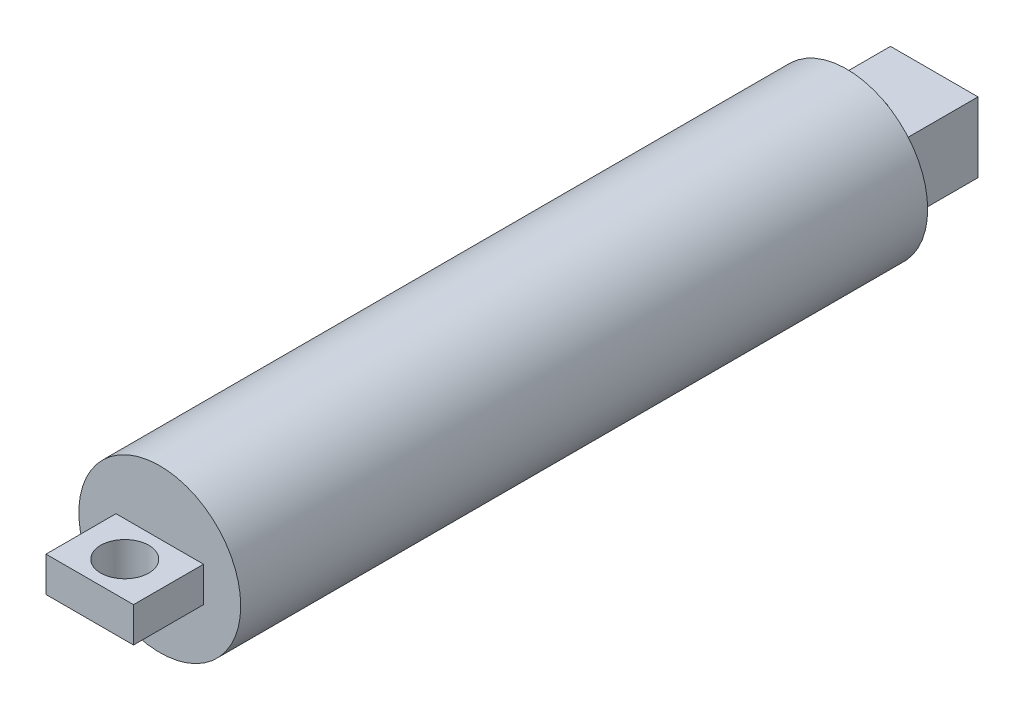
ISO-10303-21;
HEADER;
FILE_DESCRIPTION(('STEP AP214'),'2;1');
FILE_NAME('part.step','',(''),(''),'','','');
FILE_SCHEMA(('AUTOMOTIVE_DESIGN { 1 0 10303 214 1 1 1 1 }'));
ENDSEC;
DATA;
#1=APPLICATION_CONTEXT('core data for automotive mechanical design processes');
#2=APPLICATION_PROTOCOL_DEFINITION('international standard','automotive_design',2000,#1);
#3=PRODUCT_CONTEXT('',#1,'mechanical');
#4=PRODUCT('Part','Part','',(#3));
#5=PRODUCT_RELATED_PRODUCT_CATEGORY('part','',(#4));
#6=PRODUCT_DEFINITION_FORMATION('','',#4);
#7=PRODUCT_DEFINITION_CONTEXT('part definition',#1,'design');
#8=PRODUCT_DEFINITION('design','',#6,#7);
#9=PRODUCT_DEFINITION_SHAPE('','',#8);
#10=(LENGTH_UNIT() NAMED_UNIT(*) SI_UNIT(.MILLI.,.METRE.));
#11=(NAMED_UNIT(*) PLANE_ANGLE_UNIT() SI_UNIT($,.RADIAN.));
#12=(NAMED_UNIT(*) SI_UNIT($,.STERADIAN.) SOLID_ANGLE_UNIT());
#13=UNCERTAINTY_MEASURE_WITH_UNIT(LENGTH_MEASURE(1.E-05),#10,'distance_accuracy_value','');
#14=(GEOMETRIC_REPRESENTATION_CONTEXT(3) GLOBAL_UNCERTAINTY_ASSIGNED_CONTEXT((#13)) GLOBAL_UNIT_ASSIGNED_CONTEXT((#10,
#11,#12)) REPRESENTATION_CONTEXT('',''));
#15=CARTESIAN_POINT('',(0.,0.,0.));
#16=DIRECTION('',(0.,0.,1.));
#17=DIRECTION('',(1.,0.,0.));
#18=AXIS2_PLACEMENT_3D('',#15,#16,#17);
#19=CARTESIAN_POINT('',(0.,0.,0.));
#20=DIRECTION('',(0.,0.,1.));
#21=DIRECTION('',(1.,0.,0.));
#22=AXIS2_PLACEMENT_3D('',#19,#20,#21);
#23=PLANE('',#22);
#24=CARTESIAN_POINT('',(0.,0.,0.));
#25=DIRECTION('',(0.,0.,1.));
#26=DIRECTION('',(1.,0.,0.));
#27=AXIS2_PLACEMENT_3D('',#24,#25,#26);
#28=CIRCLE('',#27,9.25);
#29=CARTESIAN_POINT('',(9.25,0.,0.));
#30=VERTEX_POINT('',#29);
#31=EDGE_CURVE('E50',#30,#30,#28,.T.);
#32=ORIENTED_EDGE('',*,*,#31,.F.);
#33=EDGE_LOOP('',(#32));
#34=FACE_BOUND('',#33,.T.);
#35=DIRECTION('',(0.,-1.,0.));
#36=VECTOR('',#35,1.);
#37=CARTESIAN_POINT('',(5.,-4.,0.));
#38=LINE('',#37,#36);
#39=CARTESIAN_POINT('',(5.,4.,0.));
#40=VERTEX_POINT('',#39);
#41=CARTESIAN_POINT('',(5.,-4.,0.));
#42=VERTEX_POINT('',#41);
#43=EDGE_CURVE('E128',#40,#42,#38,.T.);
#44=ORIENTED_EDGE('',*,*,#43,.F.);
#45=DIRECTION('',(1.,0.,0.));
#46=VECTOR('',#45,1.);
#47=CARTESIAN_POINT('',(-5.,4.,0.));
#48=LINE('',#47,#46);
#49=CARTESIAN_POINT('',(-5.,4.,0.));
#50=VERTEX_POINT('',#49);
#51=EDGE_CURVE('E141',#50,#40,#48,.T.);
#52=ORIENTED_EDGE('',*,*,#51,.F.);
#53=DIRECTION('',(0.,1.,0.));
#54=VECTOR('',#53,1.);
#55=CARTESIAN_POINT('',(-5.,-4.,0.));
#56=LINE('',#55,#54);
#57=CARTESIAN_POINT('',(-5.,-4.,0.));
#58=VERTEX_POINT('',#57);
#59=EDGE_CURVE('E150',#58,#50,#56,.T.);
#60=ORIENTED_EDGE('',*,*,#59,.F.);
#61=DIRECTION('',(-1.,0.,0.));
#62=VECTOR('',#61,1.);
#63=CARTESIAN_POINT('',(-5.,-4.,0.));
#64=LINE('',#63,#62);
#65=EDGE_CURVE('E131',#42,#58,#64,.T.);
#66=ORIENTED_EDGE('',*,*,#65,.F.);
#67=EDGE_LOOP('',(#44,#52,#60,#66));
#68=FACE_BOUND('',#67,.T.);
#69=ADVANCED_FACE('F41',(#34,#68),#23,.F.);
#70=CARTESIAN_POINT('',(0.,0.,78.5));
#71=DIRECTION('',(0.,0.,-1.));
#72=DIRECTION('',(-1.,0.,0.));
#73=AXIS2_PLACEMENT_3D('',#70,#71,#72);
#74=CYLINDRICAL_SURFACE('',#73,9.25);
#75=CARTESIAN_POINT('',(0.,0.,78.5));
#76=DIRECTION('',(0.,0.,1.));
#77=DIRECTION('',(1.,0.,0.));
#78=AXIS2_PLACEMENT_3D('',#75,#76,#77);
#79=CIRCLE('',#78,9.25);
#80=CARTESIAN_POINT('',(9.25,0.,78.5));
#81=VERTEX_POINT('',#80);
#82=EDGE_CURVE('E11',#81,#81,#79,.T.);
#83=ORIENTED_EDGE('',*,*,#82,.F.);
#84=EDGE_LOOP('',(#83));
#85=FACE_BOUND('',#84,.T.);
#86=ORIENTED_EDGE('',*,*,#31,.T.);
#87=EDGE_LOOP('',(#86));
#88=FACE_BOUND('',#87,.T.);
#89=ADVANCED_FACE('F43',(#85,#88),#74,.T.);
#90=CARTESIAN_POINT('',(0.,0.,78.5));
#91=DIRECTION('',(0.,0.,1.));
#92=DIRECTION('',(1.,0.,0.));
#93=AXIS2_PLACEMENT_3D('',#90,#91,#92);
#94=PLANE('',#93);
#95=DIRECTION('',(0.,-1.,0.));
#96=VECTOR('',#95,1.);
#97=CARTESIAN_POINT('',(-5.,-2.,78.5));
#98=LINE('',#97,#96);
#99=CARTESIAN_POINT('',(-5.,2.,78.5));
#100=VERTEX_POINT('',#99);
#101=CARTESIAN_POINT('',(-5.,-2.,78.5));
#102=VERTEX_POINT('',#101);
#103=EDGE_CURVE('E58',#100,#102,#98,.T.);
#104=ORIENTED_EDGE('',*,*,#103,.F.);
#105=DIRECTION('',(-1.,0.,0.));
#106=VECTOR('',#105,1.);
#107=CARTESIAN_POINT('',(5.,2.,78.5));
#108=LINE('',#107,#106);
#109=CARTESIAN_POINT('',(5.,2.,78.5));
#110=VERTEX_POINT('',#109);
#111=EDGE_CURVE('E62',#110,#100,#108,.T.);
#112=ORIENTED_EDGE('',*,*,#111,.F.);
#113=DIRECTION('',(0.,1.,0.));
#114=VECTOR('',#113,1.);
#115=CARTESIAN_POINT('',(5.,-2.,78.5));
#116=LINE('',#115,#114);
#117=CARTESIAN_POINT('',(5.,-2.,78.5));
#118=VERTEX_POINT('',#117);
#119=EDGE_CURVE('E187',#118,#110,#116,.T.);
#120=ORIENTED_EDGE('',*,*,#119,.F.);
#121=DIRECTION('',(1.,0.,0.));
#122=VECTOR('',#121,1.);
#123=CARTESIAN_POINT('',(5.,-2.,78.5));
#124=LINE('',#123,#122);
#125=EDGE_CURVE('E185',#102,#118,#124,.T.);
#126=ORIENTED_EDGE('',*,*,#125,.F.);
#127=EDGE_LOOP('',(#104,#112,#120,#126));
#128=FACE_BOUND('',#127,.T.);
#129=ORIENTED_EDGE('',*,*,#82,.T.);
#130=EDGE_LOOP('',(#129));
#131=FACE_BOUND('',#130,.T.);
#132=ADVANCED_FACE('F196',(#128,#131),#94,.T.);
#133=CARTESIAN_POINT('',(5.,-4.,-10.));
#134=DIRECTION('',(-1.,0.,0.));
#135=DIRECTION('',(0.,0.,1.));
#136=AXIS2_PLACEMENT_3D('',#133,#134,#135);
#137=PLANE('',#136);
#138=ORIENTED_EDGE('',*,*,#43,.T.);
#139=DIRECTION('',(0.,0.,1.));
#140=VECTOR('',#139,1.);
#141=CARTESIAN_POINT('',(5.,-4.,-10.));
#142=LINE('',#141,#140);
#143=CARTESIAN_POINT('',(5.,-4.,-10.));
#144=VERTEX_POINT('',#143);
#145=EDGE_CURVE('E163',#144,#42,#142,.T.);
#146=ORIENTED_EDGE('',*,*,#145,.F.);
#147=DIRECTION('',(0.,-1.,0.));
#148=VECTOR('',#147,1.);
#149=CARTESIAN_POINT('',(5.,-4.,-10.));
#150=LINE('',#149,#148);
#151=CARTESIAN_POINT('',(5.,4.,-10.));
#152=VERTEX_POINT('',#151);
#153=EDGE_CURVE('E137',#152,#144,#150,.T.);
#154=ORIENTED_EDGE('',*,*,#153,.F.);
#155=DIRECTION('',(0.,0.,1.));
#156=VECTOR('',#155,1.);
#157=CARTESIAN_POINT('',(5.,4.,-10.));
#158=LINE('',#157,#156);
#159=EDGE_CURVE('E146',#152,#40,#158,.T.);
#160=ORIENTED_EDGE('',*,*,#159,.T.);
#161=EDGE_LOOP('',(#138,#146,#154,#160));
#162=FACE_BOUND('',#161,.T.);
#163=ADVANCED_FACE('F199',(#162),#137,.F.);
#164=CARTESIAN_POINT('',(-5.,-4.,-10.));
#165=DIRECTION('',(0.,1.,0.));
#166=DIRECTION('',(-1.,0.,0.));
#167=AXIS2_PLACEMENT_3D('',#164,#165,#166);
#168=PLANE('',#167);
#169=CARTESIAN_POINT('',(0.,-4.,-2.50000000000002));
#170=DIRECTION('',(0.,1.,0.));
#171=DIRECTION('',(-1.,0.,0.));
#172=AXIS2_PLACEMENT_3D('',#169,#170,#171);
#173=CIRCLE('',#172,1.65);
#174=CARTESIAN_POINT('',(-1.65,-4.,-2.50000000000002));
#175=VERTEX_POINT('',#174);
#176=EDGE_CURVE('E177',#175,#175,#173,.T.);
#177=ORIENTED_EDGE('',*,*,#176,.T.);
#178=EDGE_LOOP('',(#177));
#179=FACE_BOUND('',#178,.T.);
#180=ORIENTED_EDGE('',*,*,#65,.T.);
#181=DIRECTION('',(0.,0.,1.));
#182=VECTOR('',#181,1.);
#183=CARTESIAN_POINT('',(-5.,-4.,-10.));
#184=LINE('',#183,#182);
#185=CARTESIAN_POINT('',(-5.,-4.,-10.));
#186=VERTEX_POINT('',#185);
#187=EDGE_CURVE('E160',#186,#58,#184,.T.);
#188=ORIENTED_EDGE('',*,*,#187,.F.);
#189=DIRECTION('',(-1.,0.,0.));
#190=VECTOR('',#189,1.);
#191=CARTESIAN_POINT('',(-5.,-4.,-10.));
#192=LINE('',#191,#190);
#193=EDGE_CURVE('E140',#144,#186,#192,.T.);
#194=ORIENTED_EDGE('',*,*,#193,.F.);
#195=ORIENTED_EDGE('',*,*,#145,.T.);
#196=EDGE_LOOP('',(#180,#188,#194,#195));
#197=FACE_BOUND('',#196,.T.);
#198=ADVANCED_FACE('F224',(#179,#197),#168,.F.);
#199=CARTESIAN_POINT('',(-5.,-4.,-10.));
#200=DIRECTION('',(1.,0.,0.));
#201=DIRECTION('',(0.,0.,-1.));
#202=AXIS2_PLACEMENT_3D('',#199,#200,#201);
#203=PLANE('',#202);
#204=ORIENTED_EDGE('',*,*,#59,.T.);
#205=DIRECTION('',(0.,0.,1.));
#206=VECTOR('',#205,1.);
#207=CARTESIAN_POINT('',(-5.,4.,-10.));
#208=LINE('',#207,#206);
#209=CARTESIAN_POINT('',(-5.,4.,-10.));
#210=VERTEX_POINT('',#209);
#211=EDGE_CURVE('E157',#210,#50,#208,.T.);
#212=ORIENTED_EDGE('',*,*,#211,.F.);
#213=DIRECTION('',(0.,1.,0.));
#214=VECTOR('',#213,1.);
#215=CARTESIAN_POINT('',(-5.,-4.,-10.));
#216=LINE('',#215,#214);
#217=EDGE_CURVE('E143',#186,#210,#216,.T.);
#218=ORIENTED_EDGE('',*,*,#217,.F.);
#219=ORIENTED_EDGE('',*,*,#187,.T.);
#220=EDGE_LOOP('',(#204,#212,#218,#219));
#221=FACE_BOUND('',#220,.T.);
#222=ADVANCED_FACE('F222',(#221),#203,.F.);
#223=CARTESIAN_POINT('',(-5.,4.,-10.));
#224=DIRECTION('',(0.,-1.,0.));
#225=DIRECTION('',(1.,0.,0.));
#226=AXIS2_PLACEMENT_3D('',#223,#224,#225);
#227=PLANE('',#226);
#228=CARTESIAN_POINT('',(0.,4.,-2.50000000000002));
#229=DIRECTION('',(0.,-1.,0.));
#230=DIRECTION('',(1.,0.,0.));
#231=AXIS2_PLACEMENT_3D('',#228,#229,#230);
#232=CIRCLE('',#231,1.65);
#233=CARTESIAN_POINT('',(1.65,4.,-2.50000000000002));
#234=VERTEX_POINT('',#233);
#235=EDGE_CURVE('E45',#234,#234,#232,.T.);
#236=ORIENTED_EDGE('',*,*,#235,.T.);
#237=EDGE_LOOP('',(#236));
#238=FACE_BOUND('',#237,.T.);
#239=ORIENTED_EDGE('',*,*,#51,.T.);
#240=ORIENTED_EDGE('',*,*,#159,.F.);
#241=DIRECTION('',(1.,0.,0.));
#242=VECTOR('',#241,1.);
#243=CARTESIAN_POINT('',(-5.,4.,-10.));
#244=LINE('',#243,#242);
#245=EDGE_CURVE('E145',#210,#152,#244,.T.);
#246=ORIENTED_EDGE('',*,*,#245,.F.);
#247=ORIENTED_EDGE('',*,*,#211,.T.);
#248=EDGE_LOOP('',(#239,#240,#246,#247));
#249=FACE_BOUND('',#248,.T.);
#250=ADVANCED_FACE('F213',(#238,#249),#227,.F.);
#251=CARTESIAN_POINT('',(0.,0.,-10.));
#252=DIRECTION('',(0.,0.,-1.));
#253=DIRECTION('',(-1.,0.,0.));
#254=AXIS2_PLACEMENT_3D('',#251,#252,#253);
#255=PLANE('',#254);
#256=ORIENTED_EDGE('',*,*,#153,.T.);
#257=ORIENTED_EDGE('',*,*,#193,.T.);
#258=ORIENTED_EDGE('',*,*,#217,.T.);
#259=ORIENTED_EDGE('',*,*,#245,.T.);
#260=EDGE_LOOP('',(#256,#257,#258,#259));
#261=FACE_BOUND('',#260,.T.);
#262=ADVANCED_FACE('F218',(#261),#255,.T.);
#263=CARTESIAN_POINT('',(-5.,-2.,86.5));
#264=DIRECTION('',(1.,0.,0.));
#265=DIRECTION('',(0.,0.,-1.));
#266=AXIS2_PLACEMENT_3D('',#263,#264,#265);
#267=PLANE('',#266);
#268=ORIENTED_EDGE('',*,*,#103,.T.);
#269=DIRECTION('',(0.,0.,-1.));
#270=VECTOR('',#269,1.);
#271=CARTESIAN_POINT('',(-5.,-2.,86.5));
#272=LINE('',#271,#270);
#273=CARTESIAN_POINT('',(-5.,-2.,86.5));
#274=VERTEX_POINT('',#273);
#275=EDGE_CURVE('E111',#274,#102,#272,.T.);
#276=ORIENTED_EDGE('',*,*,#275,.F.);
#277=DIRECTION('',(0.,-1.,0.));
#278=VECTOR('',#277,1.);
#279=CARTESIAN_POINT('',(-5.,-2.,86.5));
#280=LINE('',#279,#278);
#281=CARTESIAN_POINT('',(-5.,2.,86.5));
#282=VERTEX_POINT('',#281);
#283=EDGE_CURVE('E117',#282,#274,#280,.T.);
#284=ORIENTED_EDGE('',*,*,#283,.F.);
#285=DIRECTION('',(0.,0.,-1.));
#286=VECTOR('',#285,1.);
#287=CARTESIAN_POINT('',(-5.,2.,86.5));
#288=LINE('',#287,#286);
#289=EDGE_CURVE('E183',#282,#100,#288,.T.);
#290=ORIENTED_EDGE('',*,*,#289,.T.);
#291=EDGE_LOOP('',(#268,#276,#284,#290));
#292=FACE_BOUND('',#291,.T.);
#293=ADVANCED_FACE('F127',(#292),#267,.F.);
#294=CARTESIAN_POINT('',(5.,-2.,86.5));
#295=DIRECTION('',(0.,1.,0.));
#296=DIRECTION('',(-1.,0.,0.));
#297=AXIS2_PLACEMENT_3D('',#294,#295,#296);
#298=PLANE('',#297);
#299=CARTESIAN_POINT('',(0.,-2.,82.5));
#300=DIRECTION('',(0.,1.,0.));
#301=DIRECTION('',(-1.,0.,0.));
#302=AXIS2_PLACEMENT_3D('',#299,#300,#301);
#303=CIRCLE('',#302,2.75);
#304=CARTESIAN_POINT('',(-2.75,-2.,82.5));
#305=VERTEX_POINT('',#304);
#306=EDGE_CURVE('E169',#305,#305,#303,.T.);
#307=ORIENTED_EDGE('',*,*,#306,.T.);
#308=EDGE_LOOP('',(#307));
#309=FACE_BOUND('',#308,.T.);
#310=ORIENTED_EDGE('',*,*,#125,.T.);
#311=DIRECTION('',(0.,0.,-1.));
#312=VECTOR('',#311,1.);
#313=CARTESIAN_POINT('',(5.,-2.,86.5));
#314=LINE('',#313,#312);
#315=CARTESIAN_POINT('',(5.,-2.,86.5));
#316=VERTEX_POINT('',#315);
#317=EDGE_CURVE('E113',#316,#118,#314,.T.);
#318=ORIENTED_EDGE('',*,*,#317,.F.);
#319=DIRECTION('',(1.,0.,0.));
#320=VECTOR('',#319,1.);
#321=CARTESIAN_POINT('',(5.,-2.,86.5));
#322=LINE('',#321,#320);
#323=EDGE_CURVE('E106',#274,#316,#322,.T.);
#324=ORIENTED_EDGE('',*,*,#323,.F.);
#325=ORIENTED_EDGE('',*,*,#275,.T.);
#326=EDGE_LOOP('',(#310,#318,#324,#325));
#327=FACE_BOUND('',#326,.T.);
#328=ADVANCED_FACE('F109',(#309,#327),#298,.F.);
#329=CARTESIAN_POINT('',(5.,-2.,86.5));
#330=DIRECTION('',(-1.,0.,0.));
#331=DIRECTION('',(0.,0.,1.));
#332=AXIS2_PLACEMENT_3D('',#329,#330,#331);
#333=PLANE('',#332);
#334=ORIENTED_EDGE('',*,*,#119,.T.);
#335=DIRECTION('',(0.,0.,-1.));
#336=VECTOR('',#335,1.);
#337=CARTESIAN_POINT('',(5.,2.,86.5));
#338=LINE('',#337,#336);
#339=CARTESIAN_POINT('',(5.,2.,86.5));
#340=VERTEX_POINT('',#339);
#341=EDGE_CURVE('E133',#340,#110,#338,.T.);
#342=ORIENTED_EDGE('',*,*,#341,.F.);
#343=DIRECTION('',(0.,1.,0.));
#344=VECTOR('',#343,1.);
#345=CARTESIAN_POINT('',(5.,-2.,86.5));
#346=LINE('',#345,#344);
#347=EDGE_CURVE('E116',#316,#340,#346,.T.);
#348=ORIENTED_EDGE('',*,*,#347,.F.);
#349=ORIENTED_EDGE('',*,*,#317,.T.);
#350=EDGE_LOOP('',(#334,#342,#348,#349));
#351=FACE_BOUND('',#350,.T.);
#352=ADVANCED_FACE('F195',(#351),#333,.F.);
#353=CARTESIAN_POINT('',(5.,2.,86.5));
#354=DIRECTION('',(0.,-1.,0.));
#355=DIRECTION('',(1.,0.,0.));
#356=AXIS2_PLACEMENT_3D('',#353,#354,#355);
#357=PLANE('',#356);
#358=CARTESIAN_POINT('',(0.,2.,82.5));
#359=DIRECTION('',(0.,-1.,0.));
#360=DIRECTION('',(1.,0.,0.));
#361=AXIS2_PLACEMENT_3D('',#358,#359,#360);
#362=CIRCLE('',#361,2.75);
#363=CARTESIAN_POINT('',(2.75,2.,82.5));
#364=VERTEX_POINT('',#363);
#365=EDGE_CURVE('E167',#364,#364,#362,.T.);
#366=ORIENTED_EDGE('',*,*,#365,.T.);
#367=EDGE_LOOP('',(#366));
#368=FACE_BOUND('',#367,.T.);
#369=ORIENTED_EDGE('',*,*,#111,.T.);
#370=ORIENTED_EDGE('',*,*,#289,.F.);
#371=DIRECTION('',(-1.,0.,0.));
#372=VECTOR('',#371,1.);
#373=CARTESIAN_POINT('',(5.,2.,86.5));
#374=LINE('',#373,#372);
#375=EDGE_CURVE('E122',#340,#282,#374,.T.);
#376=ORIENTED_EDGE('',*,*,#375,.F.);
#377=ORIENTED_EDGE('',*,*,#341,.T.);
#378=EDGE_LOOP('',(#369,#370,#376,#377));
#379=FACE_BOUND('',#378,.T.);
#380=ADVANCED_FACE('F193',(#368,#379),#357,.F.);
#381=CARTESIAN_POINT('',(0.,0.,86.5));
#382=DIRECTION('',(0.,0.,1.));
#383=DIRECTION('',(1.,0.,0.));
#384=AXIS2_PLACEMENT_3D('',#381,#382,#383);
#385=PLANE('',#384);
#386=ORIENTED_EDGE('',*,*,#283,.T.);
#387=ORIENTED_EDGE('',*,*,#323,.T.);
#388=ORIENTED_EDGE('',*,*,#347,.T.);
#389=ORIENTED_EDGE('',*,*,#375,.T.);
#390=EDGE_LOOP('',(#386,#387,#388,#389));
#391=FACE_BOUND('',#390,.T.);
#392=ADVANCED_FACE('F120',(#391),#385,.T.);
#393=CARTESIAN_POINT('',(0.,-9.25,82.5));
#394=DIRECTION('',(0.,1.,0.));
#395=DIRECTION('',(-1.,0.,0.));
#396=AXIS2_PLACEMENT_3D('',#393,#394,#395);
#397=CYLINDRICAL_SURFACE('',#396,2.75);
#398=ORIENTED_EDGE('',*,*,#365,.F.);
#399=EDGE_LOOP('',(#398));
#400=FACE_BOUND('',#399,.T.);
#401=ORIENTED_EDGE('',*,*,#306,.F.);
#402=EDGE_LOOP('',(#401));
#403=FACE_BOUND('',#402,.T.);
#404=ADVANCED_FACE('F250',(#400,#403),#397,.F.);
#405=CARTESIAN_POINT('',(0.,-9.25,-2.50000000000002));
#406=DIRECTION('',(0.,1.,0.));
#407=DIRECTION('',(-1.,0.,0.));
#408=AXIS2_PLACEMENT_3D('',#405,#406,#407);
#409=CYLINDRICAL_SURFACE('',#408,1.65);
#410=ORIENTED_EDGE('',*,*,#235,.F.);
#411=EDGE_LOOP('',(#410));
#412=FACE_BOUND('',#411,.T.);
#413=ORIENTED_EDGE('',*,*,#176,.F.);
#414=EDGE_LOOP('',(#413));
#415=FACE_BOUND('',#414,.T.);
#416=ADVANCED_FACE('F251',(#412,#415),#409,.F.);
#417=CLOSED_SHELL('',(#69,#89,#132,#163,#198,#222,#250,#262,#293,#328,#352,#380,#392,#404,#416));
#418=MANIFOLD_SOLID_BREP('B2',#417);
#419=ADVANCED_BREP_SHAPE_REPRESENTATION('',(#18,#418),#14);
#420=SHAPE_DEFINITION_REPRESENTATION(#9,#419);
ENDSEC;
END-ISO-10303-21;
